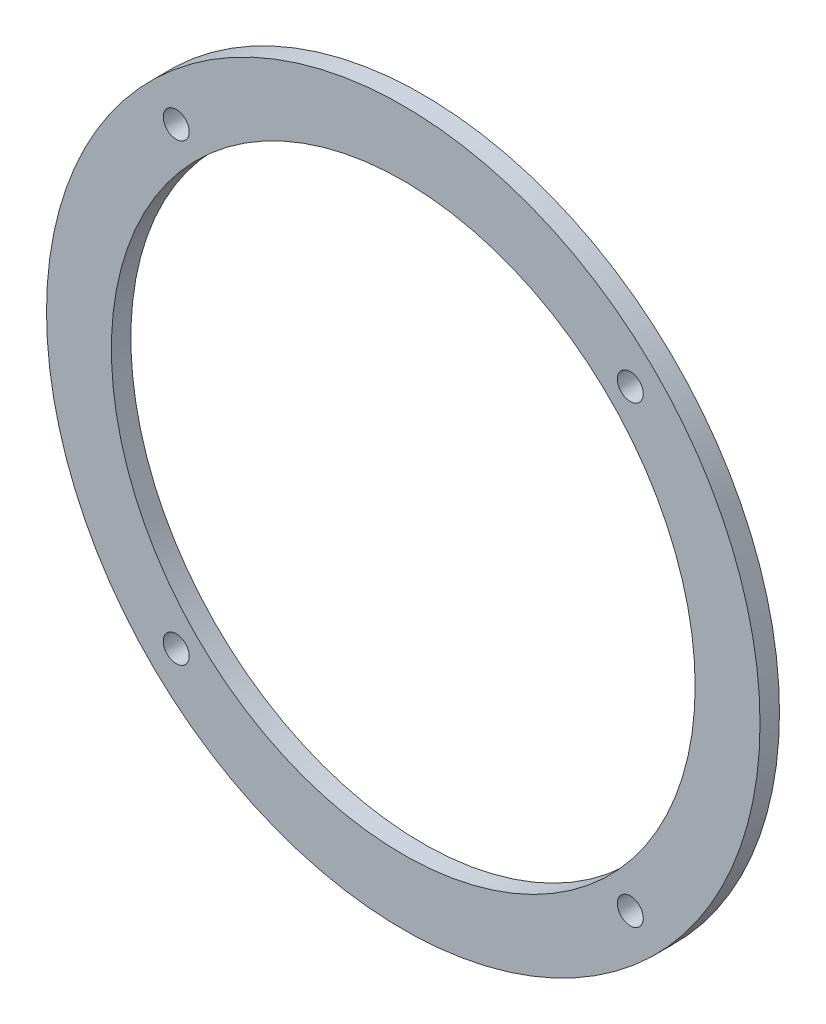
ISO-10303-21;
HEADER;
FILE_DESCRIPTION(('STEP AP214'),'2;1');
FILE_NAME('part.step','',(''),(''),'','','');
FILE_SCHEMA(('AUTOMOTIVE_DESIGN { 1 0 10303 214 1 1 1 1 }'));
ENDSEC;
DATA;
#1=APPLICATION_CONTEXT('core data for automotive mechanical design processes');
#2=APPLICATION_PROTOCOL_DEFINITION('international standard','automotive_design',2000,#1);
#3=PRODUCT_CONTEXT('',#1,'mechanical');
#4=PRODUCT('Part','Part','',(#3));
#5=PRODUCT_RELATED_PRODUCT_CATEGORY('part','',(#4));
#6=PRODUCT_DEFINITION_FORMATION('','',#4);
#7=PRODUCT_DEFINITION_CONTEXT('part definition',#1,'design');
#8=PRODUCT_DEFINITION('design','',#6,#7);
#9=PRODUCT_DEFINITION_SHAPE('','',#8);
#10=(LENGTH_UNIT() NAMED_UNIT(*) SI_UNIT(.MILLI.,.METRE.));
#11=(NAMED_UNIT(*) PLANE_ANGLE_UNIT() SI_UNIT($,.RADIAN.));
#12=(NAMED_UNIT(*) SI_UNIT($,.STERADIAN.) SOLID_ANGLE_UNIT());
#13=UNCERTAINTY_MEASURE_WITH_UNIT(LENGTH_MEASURE(1.E-05),#10,'distance_accuracy_value','');
#14=(GEOMETRIC_REPRESENTATION_CONTEXT(3) GLOBAL_UNCERTAINTY_ASSIGNED_CONTEXT((#13)) GLOBAL_UNIT_ASSIGNED_CONTEXT((#10,
#11,#12)) REPRESENTATION_CONTEXT('',''));
#15=CARTESIAN_POINT('',(0.,0.,0.));
#16=DIRECTION('',(0.,0.,1.));
#17=DIRECTION('',(1.,0.,0.));
#18=AXIS2_PLACEMENT_3D('',#15,#16,#17);
#19=CARTESIAN_POINT('',(35.0017856687341,-35.0017856687341,3.));
#20=DIRECTION('',(0.,0.,-1.));
#21=DIRECTION('',(-1.,0.,0.));
#22=AXIS2_PLACEMENT_3D('',#19,#20,#21);
#23=CYLINDRICAL_SURFACE('',#22,2.);
#24=CARTESIAN_POINT('',(35.0017856687341,-35.0017856687341,3.));
#25=DIRECTION('',(0.,0.,1.));
#26=DIRECTION('',(1.,0.,0.));
#27=AXIS2_PLACEMENT_3D('',#24,#25,#26);
#28=CIRCLE('',#27,2.);
#29=CARTESIAN_POINT('',(37.0017856687341,-35.0017856687341,3.));
#30=VERTEX_POINT('',#29);
#31=EDGE_CURVE('E53',#30,#30,#28,.T.);
#32=ORIENTED_EDGE('',*,*,#31,.T.);
#33=EDGE_LOOP('',(#32));
#34=FACE_BOUND('',#33,.T.);
#35=CARTESIAN_POINT('',(35.0017856687341,-35.0017856687341,0.));
#36=DIRECTION('',(0.,0.,1.));
#37=DIRECTION('',(1.,0.,0.));
#38=AXIS2_PLACEMENT_3D('',#35,#36,#37);
#39=CIRCLE('',#38,2.);
#40=CARTESIAN_POINT('',(37.0017856687341,-35.0017856687341,0.));
#41=VERTEX_POINT('',#40);
#42=EDGE_CURVE('E79',#41,#41,#39,.T.);
#43=ORIENTED_EDGE('',*,*,#42,.F.);
#44=EDGE_LOOP('',(#43));
#45=FACE_BOUND('',#44,.T.);
#46=ADVANCED_FACE('F44',(#34,#45),#23,.F.);
#47=CARTESIAN_POINT('',(-35.0017856687341,-35.0017856687341,3.));
#48=DIRECTION('',(0.,0.,-1.));
#49=DIRECTION('',(-1.,0.,0.));
#50=AXIS2_PLACEMENT_3D('',#47,#48,#49);
#51=CYLINDRICAL_SURFACE('',#50,2.);
#52=CARTESIAN_POINT('',(-35.0017856687341,-35.0017856687341,3.));
#53=DIRECTION('',(0.,0.,1.));
#54=DIRECTION('',(1.,0.,0.));
#55=AXIS2_PLACEMENT_3D('',#52,#53,#54);
#56=CIRCLE('',#55,2.);
#57=CARTESIAN_POINT('',(-33.0017856687341,-35.0017856687341,3.));
#58=VERTEX_POINT('',#57);
#59=EDGE_CURVE('E58',#58,#58,#56,.T.);
#60=ORIENTED_EDGE('',*,*,#59,.T.);
#61=EDGE_LOOP('',(#60));
#62=FACE_BOUND('',#61,.T.);
#63=CARTESIAN_POINT('',(-35.0017856687341,-35.0017856687341,0.));
#64=DIRECTION('',(0.,0.,1.));
#65=DIRECTION('',(1.,0.,0.));
#66=AXIS2_PLACEMENT_3D('',#63,#64,#65);
#67=CIRCLE('',#66,2.);
#68=CARTESIAN_POINT('',(-33.0017856687341,-35.0017856687341,0.));
#69=VERTEX_POINT('',#68);
#70=EDGE_CURVE('E77',#69,#69,#67,.T.);
#71=ORIENTED_EDGE('',*,*,#70,.F.);
#72=EDGE_LOOP('',(#71));
#73=FACE_BOUND('',#72,.T.);
#74=ADVANCED_FACE('F106',(#62,#73),#51,.F.);
#75=CARTESIAN_POINT('',(35.0017856687341,35.0017856687341,3.));
#76=DIRECTION('',(0.,0.,-1.));
#77=DIRECTION('',(-1.,0.,0.));
#78=AXIS2_PLACEMENT_3D('',#75,#76,#77);
#79=CYLINDRICAL_SURFACE('',#78,2.);
#80=CARTESIAN_POINT('',(35.0017856687341,35.0017856687341,3.));
#81=DIRECTION('',(0.,0.,1.));
#82=DIRECTION('',(1.,0.,0.));
#83=AXIS2_PLACEMENT_3D('',#80,#81,#82);
#84=CIRCLE('',#83,2.);
#85=CARTESIAN_POINT('',(37.0017856687341,35.0017856687341,3.));
#86=VERTEX_POINT('',#85);
#87=EDGE_CURVE('E97',#86,#86,#84,.T.);
#88=ORIENTED_EDGE('',*,*,#87,.T.);
#89=EDGE_LOOP('',(#88));
#90=FACE_BOUND('',#89,.T.);
#91=CARTESIAN_POINT('',(35.0017856687341,35.0017856687341,0.));
#92=DIRECTION('',(0.,0.,1.));
#93=DIRECTION('',(1.,0.,0.));
#94=AXIS2_PLACEMENT_3D('',#91,#92,#93);
#95=CIRCLE('',#94,2.);
#96=CARTESIAN_POINT('',(37.0017856687341,35.0017856687341,0.));
#97=VERTEX_POINT('',#96);
#98=EDGE_CURVE('E75',#97,#97,#95,.T.);
#99=ORIENTED_EDGE('',*,*,#98,.F.);
#100=EDGE_LOOP('',(#99));
#101=FACE_BOUND('',#100,.T.);
#102=ADVANCED_FACE('F121',(#90,#101),#79,.F.);
#103=CARTESIAN_POINT('',(-35.0017856687341,35.0017856687341,3.));
#104=DIRECTION('',(0.,0.,-1.));
#105=DIRECTION('',(-1.,0.,0.));
#106=AXIS2_PLACEMENT_3D('',#103,#104,#105);
#107=CYLINDRICAL_SURFACE('',#106,2.);
#108=CARTESIAN_POINT('',(-35.0017856687341,35.0017856687341,3.));
#109=DIRECTION('',(0.,0.,1.));
#110=DIRECTION('',(1.,0.,0.));
#111=AXIS2_PLACEMENT_3D('',#108,#109,#110);
#112=CIRCLE('',#111,2.);
#113=CARTESIAN_POINT('',(-33.0017856687341,35.0017856687341,3.));
#114=VERTEX_POINT('',#113);
#115=EDGE_CURVE('E93',#114,#114,#112,.T.);
#116=ORIENTED_EDGE('',*,*,#115,.T.);
#117=EDGE_LOOP('',(#116));
#118=FACE_BOUND('',#117,.T.);
#119=CARTESIAN_POINT('',(-35.0017856687341,35.0017856687341,0.));
#120=DIRECTION('',(0.,0.,1.));
#121=DIRECTION('',(1.,0.,0.));
#122=AXIS2_PLACEMENT_3D('',#119,#120,#121);
#123=CIRCLE('',#122,2.);
#124=CARTESIAN_POINT('',(-33.0017856687341,35.0017856687341,0.));
#125=VERTEX_POINT('',#124);
#126=EDGE_CURVE('E69',#125,#125,#123,.T.);
#127=ORIENTED_EDGE('',*,*,#126,.F.);
#128=EDGE_LOOP('',(#127));
#129=FACE_BOUND('',#128,.T.);
#130=ADVANCED_FACE('F129',(#118,#129),#107,.F.);
#131=CARTESIAN_POINT('',(0.,0.,3.));
#132=DIRECTION('',(0.,0.,-1.));
#133=DIRECTION('',(-1.,0.,0.));
#134=AXIS2_PLACEMENT_3D('',#131,#132,#133);
#135=CYLINDRICAL_SURFACE('',#134,45.);
#136=CARTESIAN_POINT('',(0.,0.,3.));
#137=DIRECTION('',(0.,0.,1.));
#138=DIRECTION('',(1.,0.,0.));
#139=AXIS2_PLACEMENT_3D('',#136,#137,#138);
#140=CIRCLE('',#139,45.);
#141=CARTESIAN_POINT('',(45.,0.,3.));
#142=VERTEX_POINT('',#141);
#143=EDGE_CURVE('E87',#142,#142,#140,.T.);
#144=ORIENTED_EDGE('',*,*,#143,.T.);
#145=EDGE_LOOP('',(#144));
#146=FACE_BOUND('',#145,.T.);
#147=CARTESIAN_POINT('',(0.,0.,0.));
#148=DIRECTION('',(0.,0.,1.));
#149=DIRECTION('',(1.,0.,0.));
#150=AXIS2_PLACEMENT_3D('',#147,#148,#149);
#151=CIRCLE('',#150,45.);
#152=CARTESIAN_POINT('',(45.,0.,0.));
#153=VERTEX_POINT('',#152);
#154=EDGE_CURVE('E63',#153,#153,#151,.T.);
#155=ORIENTED_EDGE('',*,*,#154,.F.);
#156=EDGE_LOOP('',(#155));
#157=FACE_BOUND('',#156,.T.);
#158=ADVANCED_FACE('F50',(#146,#157),#135,.F.);
#159=CARTESIAN_POINT('',(0.,0.,3.));
#160=DIRECTION('',(0.,0.,-1.));
#161=DIRECTION('',(-1.,0.,0.));
#162=AXIS2_PLACEMENT_3D('',#159,#160,#161);
#163=CYLINDRICAL_SURFACE('',#162,55.);
#164=CARTESIAN_POINT('',(0.,0.,3.));
#165=DIRECTION('',(0.,0.,1.));
#166=DIRECTION('',(1.,0.,0.));
#167=AXIS2_PLACEMENT_3D('',#164,#165,#166);
#168=CIRCLE('',#167,55.);
#169=CARTESIAN_POINT('',(55.,0.,3.));
#170=VERTEX_POINT('',#169);
#171=EDGE_CURVE('E10',#170,#170,#168,.T.);
#172=ORIENTED_EDGE('',*,*,#171,.F.);
#173=EDGE_LOOP('',(#172));
#174=FACE_BOUND('',#173,.T.);
#175=CARTESIAN_POINT('',(0.,0.,0.));
#176=DIRECTION('',(0.,0.,1.));
#177=DIRECTION('',(1.,0.,0.));
#178=AXIS2_PLACEMENT_3D('',#175,#176,#177);
#179=CIRCLE('',#178,55.);
#180=CARTESIAN_POINT('',(55.,0.,0.));
#181=VERTEX_POINT('',#180);
#182=EDGE_CURVE('E47',#181,#181,#179,.T.);
#183=ORIENTED_EDGE('',*,*,#182,.T.);
#184=EDGE_LOOP('',(#183));
#185=FACE_BOUND('',#184,.T.);
#186=ADVANCED_FACE('F113',(#174,#185),#163,.T.);
#187=CARTESIAN_POINT('',(0.,0.,3.));
#188=DIRECTION('',(0.,0.,1.));
#189=DIRECTION('',(1.,0.,0.));
#190=AXIS2_PLACEMENT_3D('',#187,#188,#189);
#191=PLANE('',#190);
#192=ORIENTED_EDGE('',*,*,#143,.F.);
#193=EDGE_LOOP('',(#192));
#194=FACE_BOUND('',#193,.T.);
#195=ORIENTED_EDGE('',*,*,#115,.F.);
#196=EDGE_LOOP('',(#195));
#197=FACE_BOUND('',#196,.T.);
#198=ORIENTED_EDGE('',*,*,#87,.F.);
#199=EDGE_LOOP('',(#198));
#200=FACE_BOUND('',#199,.T.);
#201=ORIENTED_EDGE('',*,*,#59,.F.);
#202=EDGE_LOOP('',(#201));
#203=FACE_BOUND('',#202,.T.);
#204=ORIENTED_EDGE('',*,*,#31,.F.);
#205=EDGE_LOOP('',(#204));
#206=FACE_BOUND('',#205,.T.);
#207=ORIENTED_EDGE('',*,*,#171,.T.);
#208=EDGE_LOOP('',(#207));
#209=FACE_BOUND('',#208,.T.);
#210=ADVANCED_FACE('F107',(#194,#197,#200,#203,#206,#209),#191,.T.);
#211=CARTESIAN_POINT('',(0.,0.,0.));
#212=DIRECTION('',(0.,0.,1.));
#213=DIRECTION('',(1.,0.,0.));
#214=AXIS2_PLACEMENT_3D('',#211,#212,#213);
#215=PLANE('',#214);
#216=ORIENTED_EDGE('',*,*,#154,.T.);
#217=EDGE_LOOP('',(#216));
#218=FACE_BOUND('',#217,.T.);
#219=ORIENTED_EDGE('',*,*,#126,.T.);
#220=EDGE_LOOP('',(#219));
#221=FACE_BOUND('',#220,.T.);
#222=ORIENTED_EDGE('',*,*,#98,.T.);
#223=EDGE_LOOP('',(#222));
#224=FACE_BOUND('',#223,.T.);
#225=ORIENTED_EDGE('',*,*,#70,.T.);
#226=EDGE_LOOP('',(#225));
#227=FACE_BOUND('',#226,.T.);
#228=ORIENTED_EDGE('',*,*,#42,.T.);
#229=EDGE_LOOP('',(#228));
#230=FACE_BOUND('',#229,.T.);
#231=ORIENTED_EDGE('',*,*,#182,.F.);
#232=EDGE_LOOP('',(#231));
#233=FACE_BOUND('',#232,.T.);
#234=ADVANCED_FACE('F115',(#218,#221,#224,#227,#230,#233),#215,.F.);
#235=CLOSED_SHELL('',(#46,#74,#102,#130,#158,#186,#210,#234));
#236=MANIFOLD_SOLID_BREP('B2',#235);
#237=ADVANCED_BREP_SHAPE_REPRESENTATION('',(#18,#236),#14);
#238=SHAPE_DEFINITION_REPRESENTATION(#9,#237);
ENDSEC;
END-ISO-10303-21;
